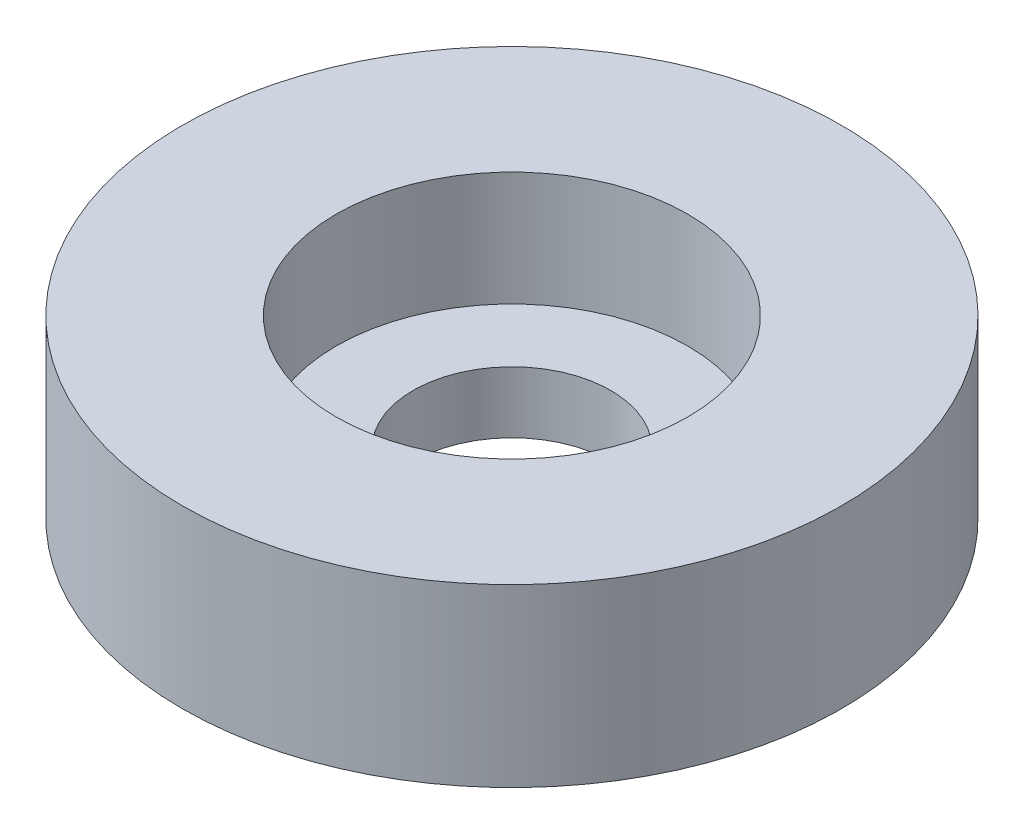
ISO-10303-21;
HEADER;
FILE_DESCRIPTION(('STEP AP214'),'2;1');
FILE_NAME('part.step','',(''),(''),'','','');
FILE_SCHEMA(('AUTOMOTIVE_DESIGN { 1 0 10303 214 1 1 1 1 }'));
ENDSEC;
DATA;
#1=APPLICATION_CONTEXT('core data for automotive mechanical design processes');
#2=APPLICATION_PROTOCOL_DEFINITION('international standard','automotive_design',2000,#1);
#3=PRODUCT_CONTEXT('',#1,'mechanical');
#4=PRODUCT('Part','Part','',(#3));
#5=PRODUCT_RELATED_PRODUCT_CATEGORY('part','',(#4));
#6=PRODUCT_DEFINITION_FORMATION('','',#4);
#7=PRODUCT_DEFINITION_CONTEXT('part definition',#1,'design');
#8=PRODUCT_DEFINITION('design','',#6,#7);
#9=PRODUCT_DEFINITION_SHAPE('','',#8);
#10=(LENGTH_UNIT() NAMED_UNIT(*) SI_UNIT(.MILLI.,.METRE.));
#11=(NAMED_UNIT(*) PLANE_ANGLE_UNIT() SI_UNIT($,.RADIAN.));
#12=(NAMED_UNIT(*) SI_UNIT($,.STERADIAN.) SOLID_ANGLE_UNIT());
#13=UNCERTAINTY_MEASURE_WITH_UNIT(LENGTH_MEASURE(1.E-05),#10,'distance_accuracy_value','');
#14=(GEOMETRIC_REPRESENTATION_CONTEXT(3) GLOBAL_UNCERTAINTY_ASSIGNED_CONTEXT((#13)) GLOBAL_UNIT_ASSIGNED_CONTEXT((#10,
#11,#12)) REPRESENTATION_CONTEXT('',''));
#15=CARTESIAN_POINT('',(0.,0.,0.));
#16=DIRECTION('',(0.,0.,1.));
#17=DIRECTION('',(1.,0.,0.));
#18=AXIS2_PLACEMENT_3D('',#15,#16,#17);
#19=CARTESIAN_POINT('',(0.,4.,0.));
#20=DIRECTION('',(0.,-1.,0.));
#21=DIRECTION('',(0.,0.,-1.));
#22=AXIS2_PLACEMENT_3D('',#19,#20,#21);
#23=CYLINDRICAL_SURFACE('',#22,7.5);
#24=CARTESIAN_POINT('',(0.,4.,0.));
#25=DIRECTION('',(0.,1.,0.));
#26=DIRECTION('',(0.,0.,1.));
#27=AXIS2_PLACEMENT_3D('',#24,#25,#26);
#28=CIRCLE('',#27,7.5);
#29=CARTESIAN_POINT('',(0.,4.,7.5));
#30=VERTEX_POINT('',#29);
#31=EDGE_CURVE('E10',#30,#30,#28,.T.);
#32=ORIENTED_EDGE('',*,*,#31,.F.);
#33=EDGE_LOOP('',(#32));
#34=FACE_BOUND('',#33,.T.);
#35=CARTESIAN_POINT('',(0.,0.,0.));
#36=DIRECTION('',(0.,1.,0.));
#37=DIRECTION('',(0.,0.,1.));
#38=AXIS2_PLACEMENT_3D('',#35,#36,#37);
#39=CIRCLE('',#38,7.5);
#40=CARTESIAN_POINT('',(0.,0.,7.5));
#41=VERTEX_POINT('',#40);
#42=EDGE_CURVE('E38',#41,#41,#39,.T.);
#43=ORIENTED_EDGE('',*,*,#42,.T.);
#44=EDGE_LOOP('',(#43));
#45=FACE_BOUND('',#44,.T.);
#46=ADVANCED_FACE('F35',(#34,#45),#23,.T.);
#47=CARTESIAN_POINT('',(0.,4.,0.));
#48=DIRECTION('',(0.,1.,0.));
#49=DIRECTION('',(0.,0.,1.));
#50=AXIS2_PLACEMENT_3D('',#47,#48,#49);
#51=PLANE('',#50);
#52=CARTESIAN_POINT('',(0.,4.,0.));
#53=DIRECTION('',(0.,1.,0.));
#54=DIRECTION('',(0.,0.,1.));
#55=AXIS2_PLACEMENT_3D('',#52,#53,#54);
#56=CIRCLE('',#55,4.);
#57=CARTESIAN_POINT('',(0.,4.,4.));
#58=VERTEX_POINT('',#57);
#59=EDGE_CURVE('E55',#58,#58,#56,.T.);
#60=ORIENTED_EDGE('',*,*,#59,.F.);
#61=EDGE_LOOP('',(#60));
#62=FACE_BOUND('',#61,.T.);
#63=ORIENTED_EDGE('',*,*,#31,.T.);
#64=EDGE_LOOP('',(#63));
#65=FACE_BOUND('',#64,.T.);
#66=ADVANCED_FACE('F61',(#62,#65),#51,.T.);
#67=CARTESIAN_POINT('',(0.,0.,0.));
#68=DIRECTION('',(0.,1.,0.));
#69=DIRECTION('',(0.,0.,1.));
#70=AXIS2_PLACEMENT_3D('',#67,#68,#69);
#71=PLANE('',#70);
#72=CARTESIAN_POINT('',(0.,0.,0.));
#73=DIRECTION('',(0.,1.,0.));
#74=DIRECTION('',(0.,0.,1.));
#75=AXIS2_PLACEMENT_3D('',#72,#73,#74);
#76=CIRCLE('',#75,2.25);
#77=CARTESIAN_POINT('',(0.,0.,2.25));
#78=VERTEX_POINT('',#77);
#79=EDGE_CURVE('E45',#78,#78,#76,.T.);
#80=ORIENTED_EDGE('',*,*,#79,.T.);
#81=EDGE_LOOP('',(#80));
#82=FACE_BOUND('',#81,.T.);
#83=ORIENTED_EDGE('',*,*,#42,.F.);
#84=EDGE_LOOP('',(#83));
#85=FACE_BOUND('',#84,.T.);
#86=ADVANCED_FACE('F63',(#82,#85),#71,.F.);
#87=CARTESIAN_POINT('',(0.,4.,0.));
#88=DIRECTION('',(0.,1.,0.));
#89=DIRECTION('',(0.,0.,1.));
#90=AXIS2_PLACEMENT_3D('',#87,#88,#89);
#91=CYLINDRICAL_SURFACE('',#90,2.25);
#92=ORIENTED_EDGE('',*,*,#79,.F.);
#93=EDGE_LOOP('',(#92));
#94=FACE_BOUND('',#93,.T.);
#95=CARTESIAN_POINT('',(0.,1.4,0.));
#96=DIRECTION('',(0.,1.,0.));
#97=DIRECTION('',(0.,0.,1.));
#98=AXIS2_PLACEMENT_3D('',#95,#96,#97);
#99=CIRCLE('',#98,2.25);
#100=CARTESIAN_POINT('',(0.,1.4,2.25));
#101=VERTEX_POINT('',#100);
#102=EDGE_CURVE('E49',#101,#101,#99,.T.);
#103=ORIENTED_EDGE('',*,*,#102,.T.);
#104=EDGE_LOOP('',(#103));
#105=FACE_BOUND('',#104,.T.);
#106=ADVANCED_FACE('F69',(#94,#105),#91,.F.);
#107=CARTESIAN_POINT('',(2.25,1.4,0.));
#108=DIRECTION('',(0.,-1.,0.));
#109=DIRECTION('',(0.,0.,-1.));
#110=AXIS2_PLACEMENT_3D('',#107,#108,#109);
#111=PLANE('',#110);
#112=ORIENTED_EDGE('',*,*,#102,.F.);
#113=EDGE_LOOP('',(#112));
#114=FACE_BOUND('',#113,.T.);
#115=CARTESIAN_POINT('',(0.,1.4,0.));
#116=DIRECTION('',(0.,1.,0.));
#117=DIRECTION('',(0.,0.,1.));
#118=AXIS2_PLACEMENT_3D('',#115,#116,#117);
#119=CIRCLE('',#118,4.);
#120=CARTESIAN_POINT('',(0.,1.4,4.));
#121=VERTEX_POINT('',#120);
#122=EDGE_CURVE('E52',#121,#121,#119,.T.);
#123=ORIENTED_EDGE('',*,*,#122,.T.);
#124=EDGE_LOOP('',(#123));
#125=FACE_BOUND('',#124,.T.);
#126=ADVANCED_FACE('F75',(#114,#125),#111,.F.);
#127=CARTESIAN_POINT('',(0.,4.,0.));
#128=DIRECTION('',(0.,1.,0.));
#129=DIRECTION('',(0.,0.,1.));
#130=AXIS2_PLACEMENT_3D('',#127,#128,#129);
#131=CYLINDRICAL_SURFACE('',#130,4.);
#132=ORIENTED_EDGE('',*,*,#122,.F.);
#133=EDGE_LOOP('',(#132));
#134=FACE_BOUND('',#133,.T.);
#135=ORIENTED_EDGE('',*,*,#59,.T.);
#136=EDGE_LOOP('',(#135));
#137=FACE_BOUND('',#136,.T.);
#138=ADVANCED_FACE('F59',(#134,#137),#131,.F.);
#139=CLOSED_SHELL('',(#46,#66,#86,#106,#126,#138));
#140=MANIFOLD_SOLID_BREP('B2',#139);
#141=ADVANCED_BREP_SHAPE_REPRESENTATION('',(#18,#140),#14);
#142=SHAPE_DEFINITION_REPRESENTATION(#9,#141);
ENDSEC;
END-ISO-10303-21;
